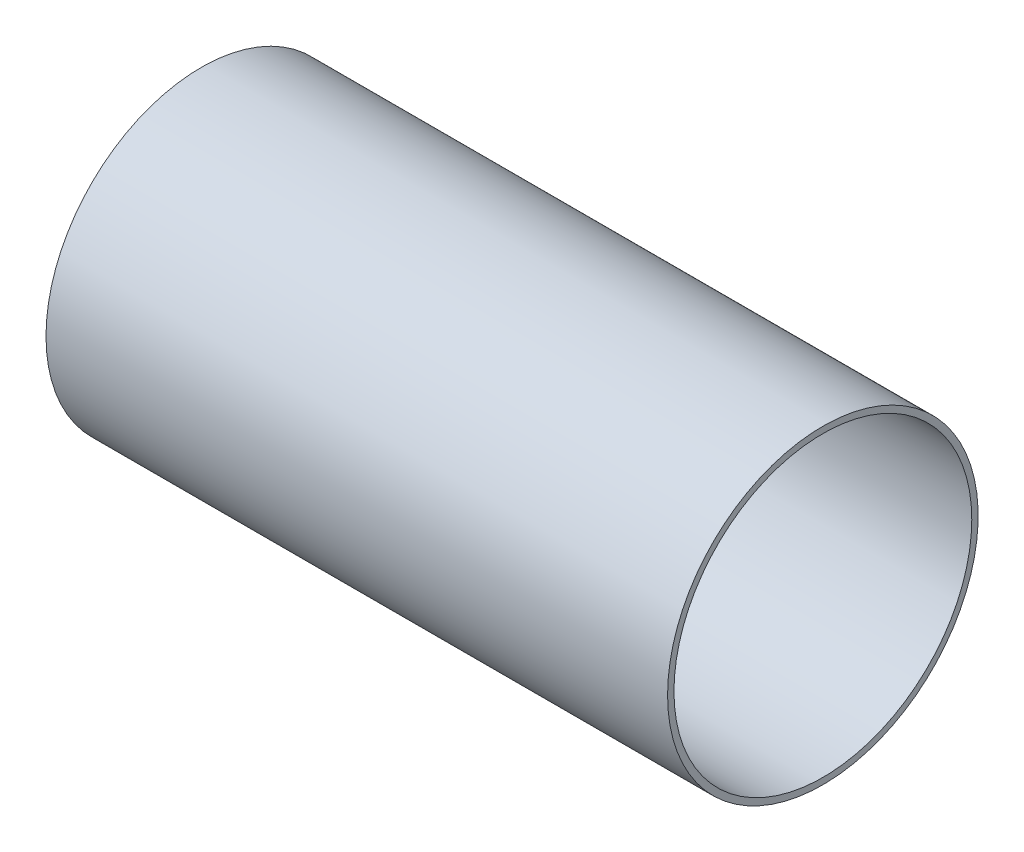
ISO-10303-21;
HEADER;
FILE_DESCRIPTION(('STEP AP214'),'2;1');
FILE_NAME('part.step','',(''),(''),'','','');
FILE_SCHEMA(('AUTOMOTIVE_DESIGN { 1 0 10303 214 1 1 1 1 }'));
ENDSEC;
DATA;
#1=APPLICATION_CONTEXT('core data for automotive mechanical design processes');
#2=APPLICATION_PROTOCOL_DEFINITION('international standard','automotive_design',2000,#1);
#3=PRODUCT_CONTEXT('',#1,'mechanical');
#4=PRODUCT('Part','Part','',(#3));
#5=PRODUCT_RELATED_PRODUCT_CATEGORY('part','',(#4));
#6=PRODUCT_DEFINITION_FORMATION('','',#4);
#7=PRODUCT_DEFINITION_CONTEXT('part definition',#1,'design');
#8=PRODUCT_DEFINITION('design','',#6,#7);
#9=PRODUCT_DEFINITION_SHAPE('','',#8);
#10=(LENGTH_UNIT() NAMED_UNIT(*) SI_UNIT(.MILLI.,.METRE.));
#11=(NAMED_UNIT(*) PLANE_ANGLE_UNIT() SI_UNIT($,.RADIAN.));
#12=(NAMED_UNIT(*) SI_UNIT($,.STERADIAN.) SOLID_ANGLE_UNIT());
#13=UNCERTAINTY_MEASURE_WITH_UNIT(LENGTH_MEASURE(1.E-05),#10,'distance_accuracy_value','');
#14=(GEOMETRIC_REPRESENTATION_CONTEXT(3) GLOBAL_UNCERTAINTY_ASSIGNED_CONTEXT((#13)) GLOBAL_UNIT_ASSIGNED_CONTEXT((#10,
#11,#12)) REPRESENTATION_CONTEXT('',''));
#15=CARTESIAN_POINT('',(0.,0.,0.));
#16=DIRECTION('',(0.,0.,1.));
#17=DIRECTION('',(1.,0.,0.));
#18=AXIS2_PLACEMENT_3D('',#15,#16,#17);
#19=CARTESIAN_POINT('',(152.4,0.,0.));
#20=DIRECTION('',(1.,0.,0.));
#21=DIRECTION('',(0.,0.,-1.));
#22=AXIS2_PLACEMENT_3D('',#19,#20,#21);
#23=PLANE('',#22);
#24=CARTESIAN_POINT('',(152.4,0.,0.));
#25=DIRECTION('',(1.,0.,0.));
#26=DIRECTION('',(0.,0.,-1.));
#27=AXIS2_PLACEMENT_3D('',#24,#25,#26);
#28=CIRCLE('',#27,38.0746);
#29=CARTESIAN_POINT('',(152.4,0.,38.0746));
#30=VERTEX_POINT('',#29);
#31=EDGE_CURVE('E10',#30,#30,#28,.T.);
#32=ORIENTED_EDGE('',*,*,#31,.T.);
#33=EDGE_LOOP('',(#32));
#34=FACE_BOUND('',#33,.T.);
#35=CARTESIAN_POINT('',(152.4,0.,0.));
#36=DIRECTION('',(1.,0.,0.));
#37=DIRECTION('',(0.,0.,-1.));
#38=AXIS2_PLACEMENT_3D('',#35,#36,#37);
#39=CIRCLE('',#38,36.5125);
#40=CARTESIAN_POINT('',(152.4,0.,36.5125));
#41=VERTEX_POINT('',#40);
#42=EDGE_CURVE('E56',#41,#41,#39,.T.);
#43=ORIENTED_EDGE('',*,*,#42,.F.);
#44=EDGE_LOOP('',(#43));
#45=FACE_BOUND('',#44,.T.);
#46=ADVANCED_FACE('F43',(#34,#45),#23,.T.);
#47=CARTESIAN_POINT('',(0.,0.,0.));
#48=DIRECTION('',(1.,0.,0.));
#49=DIRECTION('',(0.,0.,-1.));
#50=AXIS2_PLACEMENT_3D('',#47,#48,#49);
#51=PLANE('',#50);
#52=CARTESIAN_POINT('',(0.,0.,0.));
#53=DIRECTION('',(1.,0.,0.));
#54=DIRECTION('',(0.,0.,-1.));
#55=AXIS2_PLACEMENT_3D('',#52,#53,#54);
#56=CIRCLE('',#55,38.0746);
#57=CARTESIAN_POINT('',(0.,0.,38.0746));
#58=VERTEX_POINT('',#57);
#59=EDGE_CURVE('E47',#58,#58,#56,.T.);
#60=ORIENTED_EDGE('',*,*,#59,.F.);
#61=EDGE_LOOP('',(#60));
#62=FACE_BOUND('',#61,.T.);
#63=CARTESIAN_POINT('',(0.,0.,0.));
#64=DIRECTION('',(1.,0.,0.));
#65=DIRECTION('',(0.,0.,-1.));
#66=AXIS2_PLACEMENT_3D('',#63,#64,#65);
#67=CIRCLE('',#66,36.5125);
#68=CARTESIAN_POINT('',(0.,0.,36.5125));
#69=VERTEX_POINT('',#68);
#70=EDGE_CURVE('E58',#69,#69,#67,.T.);
#71=ORIENTED_EDGE('',*,*,#70,.T.);
#72=EDGE_LOOP('',(#71));
#73=FACE_BOUND('',#72,.T.);
#74=ADVANCED_FACE('F70',(#62,#73),#51,.F.);
#75=CARTESIAN_POINT('',(152.4,0.,0.));
#76=DIRECTION('',(-1.,0.,0.));
#77=DIRECTION('',(0.,0.,1.));
#78=AXIS2_PLACEMENT_3D('',#75,#76,#77);
#79=CYLINDRICAL_SURFACE('',#78,38.0746);
#80=CARTESIAN_POINT('',(152.4,0.,38.0746));
#81=CARTESIAN_POINT('',(150.8125,0.,38.0746));
#82=CARTESIAN_POINT('',(149.225,0.,38.0746));
#83=CARTESIAN_POINT('',(146.05,0.,38.0746));
#84=CARTESIAN_POINT('',(144.4625,0.,38.0746));
#85=CARTESIAN_POINT('',(141.2875,0.,38.0746));
#86=CARTESIAN_POINT('',(139.7,0.,38.0746));
#87=CARTESIAN_POINT('',(136.525,0.,38.0746));
#88=CARTESIAN_POINT('',(134.9375,0.,38.0746));
#89=CARTESIAN_POINT('',(131.7625,0.,38.0746));
#90=CARTESIAN_POINT('',(130.175,0.,38.0746));
#91=CARTESIAN_POINT('',(127.,0.,38.0746));
#92=CARTESIAN_POINT('',(125.4125,0.,38.0746));
#93=CARTESIAN_POINT('',(122.2375,0.,38.0746));
#94=CARTESIAN_POINT('',(120.65,0.,38.0746));
#95=CARTESIAN_POINT('',(117.475,0.,38.0746));
#96=CARTESIAN_POINT('',(115.8875,0.,38.0746));
#97=CARTESIAN_POINT('',(112.7125,0.,38.0746));
#98=CARTESIAN_POINT('',(111.125,0.,38.0746));
#99=CARTESIAN_POINT('',(107.95,0.,38.0746));
#100=CARTESIAN_POINT('',(106.3625,0.,38.0746));
#101=CARTESIAN_POINT('',(103.1875,0.,38.0746));
#102=CARTESIAN_POINT('',(101.6,0.,38.0746));
#103=CARTESIAN_POINT('',(98.425,0.,38.0746));
#104=CARTESIAN_POINT('',(96.8375,0.,38.0746));
#105=CARTESIAN_POINT('',(93.6625,0.,38.0746));
#106=CARTESIAN_POINT('',(92.075,0.,38.0746));
#107=CARTESIAN_POINT('',(88.9,0.,38.0746));
#108=CARTESIAN_POINT('',(87.3125,0.,38.0746));
#109=CARTESIAN_POINT('',(84.1375,0.,38.0746));
#110=CARTESIAN_POINT('',(82.55,0.,38.0746));
#111=CARTESIAN_POINT('',(79.375,0.,38.0746));
#112=CARTESIAN_POINT('',(77.7875,0.,38.0746));
#113=CARTESIAN_POINT('',(74.6125,0.,38.0746));
#114=CARTESIAN_POINT('',(73.025,0.,38.0746));
#115=CARTESIAN_POINT('',(69.85,0.,38.0746));
#116=CARTESIAN_POINT('',(68.2625,0.,38.0746));
#117=CARTESIAN_POINT('',(65.0875,0.,38.0746));
#118=CARTESIAN_POINT('',(63.5,0.,38.0746));
#119=CARTESIAN_POINT('',(60.325,0.,38.0746));
#120=CARTESIAN_POINT('',(58.7375,0.,38.0746));
#121=CARTESIAN_POINT('',(55.5625,0.,38.0746));
#122=CARTESIAN_POINT('',(53.975,0.,38.0746));
#123=CARTESIAN_POINT('',(50.8,0.,38.0746));
#124=CARTESIAN_POINT('',(49.2125,0.,38.0746));
#125=CARTESIAN_POINT('',(46.0375,0.,38.0746));
#126=CARTESIAN_POINT('',(44.45,0.,38.0746));
#127=CARTESIAN_POINT('',(41.275,0.,38.0746));
#128=CARTESIAN_POINT('',(39.6875,0.,38.0746));
#129=CARTESIAN_POINT('',(36.5125,0.,38.0746));
#130=CARTESIAN_POINT('',(34.925,0.,38.0746));
#131=CARTESIAN_POINT('',(31.75,0.,38.0746));
#132=CARTESIAN_POINT('',(30.1625,0.,38.0746));
#133=CARTESIAN_POINT('',(26.9875,0.,38.0746));
#134=CARTESIAN_POINT('',(25.4,0.,38.0746));
#135=CARTESIAN_POINT('',(22.225,0.,38.0746));
#136=CARTESIAN_POINT('',(20.6375,0.,38.0746));
#137=CARTESIAN_POINT('',(17.4625,0.,38.0746));
#138=CARTESIAN_POINT('',(15.875,0.,38.0746));
#139=CARTESIAN_POINT('',(12.7,0.,38.0746));
#140=CARTESIAN_POINT('',(11.1125,0.,38.0746));
#141=CARTESIAN_POINT('',(7.93750000000001,0.,38.0746));
#142=CARTESIAN_POINT('',(6.35,0.,38.0746));
#143=CARTESIAN_POINT('',(3.175,0.,38.0746));
#144=CARTESIAN_POINT('',(1.5875,0.,38.0746));
#145=CARTESIAN_POINT('',(0.,0.,38.0746));
#146=B_SPLINE_CURVE_WITH_KNOTS('',3,(#80,#81,#82,#83,#84,#85,#86,#87,#88,#89,#90,#91,#92,#93,
#94,#95,#96,#97,#98,#99,#100,#101,#102,#103,#104,#105,#106,#107,#108,#109,#110,#111,#112,#113,
#114,#115,#116,#117,#118,#119,#120,#121,#122,#123,#124,#125,#126,#127,#128,#129,#130,#131,#132,
#133,#134,#135,#136,#137,#138,#139,#140,#141,#142,#143,#144,#145),.UNSPECIFIED.,.F.,.F.,(4,2,2,
2,2,2,2,2,2,2,2,2,2,2,2,2,2,2,2,2,2,2,2,2,2,2,2,2,2,2,2,2,4),(0.,4.7625,9.52500000000001,
14.2875,19.05,23.8125,28.575,33.3375,38.1,42.8625,47.625,52.3875,57.15,61.9125,66.675,71.4375,
76.2,80.9625,85.725,90.4875,95.25,100.0125,104.775,109.5375,114.3,119.0625,123.825,128.5875,
133.35,138.1125,142.875,147.6375,152.4),.UNSPECIFIED.);
#147=EDGE_CURVE('BSEAM45',#30,#58,#146,.T.);
#148=ORIENTED_EDGE('',*,*,#31,.F.);
#149=ORIENTED_EDGE('',*,*,#59,.T.);
#150=ORIENTED_EDGE('',*,*,#147,.T.);
#151=ORIENTED_EDGE('',*,*,#147,.F.);
#152=EDGE_LOOP('',(#148,#150,#149,#151));
#153=FACE_BOUND('',#152,.T.);
#154=ADVANCED_FACE('F45',(#153),#79,.T.);
#155=CARTESIAN_POINT('',(152.4,0.,0.));
#156=DIRECTION('',(-1.,0.,0.));
#157=DIRECTION('',(0.,0.,1.));
#158=AXIS2_PLACEMENT_3D('',#155,#156,#157);
#159=CYLINDRICAL_SURFACE('',#158,36.5125);
#160=CARTESIAN_POINT('',(152.4,0.,36.5125));
#161=CARTESIAN_POINT('',(150.8125,0.,36.5125));
#162=CARTESIAN_POINT('',(149.225,0.,36.5125));
#163=CARTESIAN_POINT('',(146.05,0.,36.5125));
#164=CARTESIAN_POINT('',(144.4625,0.,36.5125));
#165=CARTESIAN_POINT('',(141.2875,0.,36.5125));
#166=CARTESIAN_POINT('',(139.7,0.,36.5125));
#167=CARTESIAN_POINT('',(136.525,0.,36.5125));
#168=CARTESIAN_POINT('',(134.9375,0.,36.5125));
#169=CARTESIAN_POINT('',(131.7625,0.,36.5125));
#170=CARTESIAN_POINT('',(130.175,0.,36.5125));
#171=CARTESIAN_POINT('',(127.,0.,36.5125));
#172=CARTESIAN_POINT('',(125.4125,0.,36.5125));
#173=CARTESIAN_POINT('',(122.2375,0.,36.5125));
#174=CARTESIAN_POINT('',(120.65,0.,36.5125));
#175=CARTESIAN_POINT('',(117.475,0.,36.5125));
#176=CARTESIAN_POINT('',(115.8875,0.,36.5125));
#177=CARTESIAN_POINT('',(112.7125,0.,36.5125));
#178=CARTESIAN_POINT('',(111.125,0.,36.5125));
#179=CARTESIAN_POINT('',(107.95,0.,36.5125));
#180=CARTESIAN_POINT('',(106.3625,0.,36.5125));
#181=CARTESIAN_POINT('',(103.1875,0.,36.5125));
#182=CARTESIAN_POINT('',(101.6,0.,36.5125));
#183=CARTESIAN_POINT('',(98.425,0.,36.5125));
#184=CARTESIAN_POINT('',(96.8375,0.,36.5125));
#185=CARTESIAN_POINT('',(93.6625,0.,36.5125));
#186=CARTESIAN_POINT('',(92.075,0.,36.5125));
#187=CARTESIAN_POINT('',(88.9,0.,36.5125));
#188=CARTESIAN_POINT('',(87.3125,0.,36.5125));
#189=CARTESIAN_POINT('',(84.1375,0.,36.5125));
#190=CARTESIAN_POINT('',(82.55,0.,36.5125));
#191=CARTESIAN_POINT('',(79.375,0.,36.5125));
#192=CARTESIAN_POINT('',(77.7875,0.,36.5125));
#193=CARTESIAN_POINT('',(74.6125,0.,36.5125));
#194=CARTESIAN_POINT('',(73.025,0.,36.5125));
#195=CARTESIAN_POINT('',(69.85,0.,36.5125));
#196=CARTESIAN_POINT('',(68.2625,0.,36.5125));
#197=CARTESIAN_POINT('',(65.0875,0.,36.5125));
#198=CARTESIAN_POINT('',(63.5,0.,36.5125));
#199=CARTESIAN_POINT('',(60.325,0.,36.5125));
#200=CARTESIAN_POINT('',(58.7375,0.,36.5125));
#201=CARTESIAN_POINT('',(55.5625,0.,36.5125));
#202=CARTESIAN_POINT('',(53.975,0.,36.5125));
#203=CARTESIAN_POINT('',(50.8,0.,36.5125));
#204=CARTESIAN_POINT('',(49.2125,0.,36.5125));
#205=CARTESIAN_POINT('',(46.0375,0.,36.5125));
#206=CARTESIAN_POINT('',(44.45,0.,36.5125));
#207=CARTESIAN_POINT('',(41.275,0.,36.5125));
#208=CARTESIAN_POINT('',(39.6875,0.,36.5125));
#209=CARTESIAN_POINT('',(36.5125,0.,36.5125));
#210=CARTESIAN_POINT('',(34.925,0.,36.5125));
#211=CARTESIAN_POINT('',(31.75,0.,36.5125));
#212=CARTESIAN_POINT('',(30.1625,0.,36.5125));
#213=CARTESIAN_POINT('',(26.9875,0.,36.5125));
#214=CARTESIAN_POINT('',(25.4,0.,36.5125));
#215=CARTESIAN_POINT('',(22.225,0.,36.5125));
#216=CARTESIAN_POINT('',(20.6375,0.,36.5125));
#217=CARTESIAN_POINT('',(17.4625,0.,36.5125));
#218=CARTESIAN_POINT('',(15.875,0.,36.5125));
#219=CARTESIAN_POINT('',(12.7,0.,36.5125));
#220=CARTESIAN_POINT('',(11.1125,0.,36.5125));
#221=CARTESIAN_POINT('',(7.93750000000001,0.,36.5125));
#222=CARTESIAN_POINT('',(6.35,0.,36.5125));
#223=CARTESIAN_POINT('',(3.175,0.,36.5125));
#224=CARTESIAN_POINT('',(1.5875,0.,36.5125));
#225=CARTESIAN_POINT('',(0.,0.,36.5125));
#226=B_SPLINE_CURVE_WITH_KNOTS('',3,(#160,#161,#162,#163,#164,#165,#166,#167,#168,#169,#170,
#171,#172,#173,#174,#175,#176,#177,#178,#179,#180,#181,#182,#183,#184,#185,#186,#187,#188,#189,
#190,#191,#192,#193,#194,#195,#196,#197,#198,#199,#200,#201,#202,#203,#204,#205,#206,#207,#208,
#209,#210,#211,#212,#213,#214,#215,#216,#217,#218,#219,#220,#221,#222,#223,#224,#225),
.UNSPECIFIED.,.F.,.F.,(4,2,2,2,2,2,2,2,2,2,2,2,2,2,2,2,2,2,2,2,2,2,2,2,2,2,2,2,2,2,2,2,4),(0.,
4.76249999999998,9.52499999999998,14.2875,19.05,23.8125,28.575,33.3375,38.1,42.8625,47.625,
52.3875,57.15,61.9125,66.675,71.4375,76.2,80.9625,85.725,90.4875,95.25,100.0125,104.775,
109.5375,114.3,119.0625,123.825,128.5875,133.35,138.1125,142.875,147.6375,152.4),.UNSPECIFIED.);
#227=EDGE_CURVE('BSEAM66',#41,#69,#226,.T.);
#228=ORIENTED_EDGE('',*,*,#42,.T.);
#229=ORIENTED_EDGE('',*,*,#70,.F.);
#230=ORIENTED_EDGE('',*,*,#227,.T.);
#231=ORIENTED_EDGE('',*,*,#227,.F.);
#232=EDGE_LOOP('',(#228,#230,#229,#231));
#233=FACE_BOUND('',#232,.T.);
#234=ADVANCED_FACE('F66',(#233),#159,.F.);
#235=CLOSED_SHELL('',(#46,#74,#154,#234));
#236=MANIFOLD_SOLID_BREP('B2',#235);
#237=ADVANCED_BREP_SHAPE_REPRESENTATION('',(#18,#236),#14);
#238=SHAPE_DEFINITION_REPRESENTATION(#9,#237);
ENDSEC;
END-ISO-10303-21;
